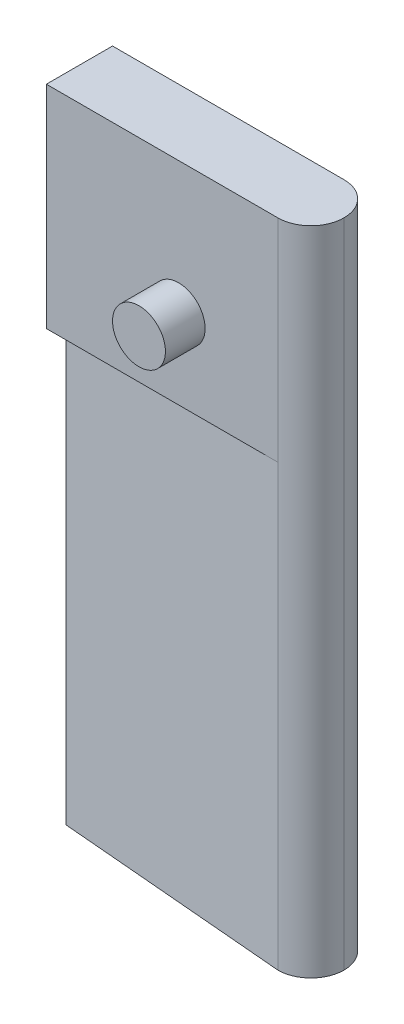
ISO-10303-21;
HEADER;
FILE_DESCRIPTION(('STEP AP214'),'2;1');
FILE_NAME('part.step','',(''),(''),'','','');
FILE_SCHEMA(('AUTOMOTIVE_DESIGN { 1 0 10303 214 1 1 1 1 }'));
ENDSEC;
DATA;
#1=APPLICATION_CONTEXT('core data for automotive mechanical design processes');
#2=APPLICATION_PROTOCOL_DEFINITION('international standard','automotive_design',2000,#1);
#3=PRODUCT_CONTEXT('',#1,'mechanical');
#4=PRODUCT('Part','Part','',(#3));
#5=PRODUCT_RELATED_PRODUCT_CATEGORY('part','',(#4));
#6=PRODUCT_DEFINITION_FORMATION('','',#4);
#7=PRODUCT_DEFINITION_CONTEXT('part definition',#1,'design');
#8=PRODUCT_DEFINITION('design','',#6,#7);
#9=PRODUCT_DEFINITION_SHAPE('','',#8);
#10=(LENGTH_UNIT() NAMED_UNIT(*) SI_UNIT(.MILLI.,.METRE.));
#11=(NAMED_UNIT(*) PLANE_ANGLE_UNIT() SI_UNIT($,.RADIAN.));
#12=(NAMED_UNIT(*) SI_UNIT($,.STERADIAN.) SOLID_ANGLE_UNIT());
#13=UNCERTAINTY_MEASURE_WITH_UNIT(LENGTH_MEASURE(1.E-05),#10,'distance_accuracy_value','');
#14=(GEOMETRIC_REPRESENTATION_CONTEXT(3) GLOBAL_UNCERTAINTY_ASSIGNED_CONTEXT((#13)) GLOBAL_UNIT_ASSIGNED_CONTEXT((#10,
#11,#12)) REPRESENTATION_CONTEXT('',''));
#15=CARTESIAN_POINT('',(0.,0.,0.));
#16=DIRECTION('',(0.,0.,1.));
#17=DIRECTION('',(1.,0.,0.));
#18=AXIS2_PLACEMENT_3D('',#15,#16,#17);
#19=CARTESIAN_POINT('',(-10.,0.,2.5));
#20=DIRECTION('',(0.,1.,0.));
#21=DIRECTION('',(-1.,0.,0.));
#22=AXIS2_PLACEMENT_3D('',#19,#20,#21);
#23=PLANE('',#22);
#24=DIRECTION('',(-0.996346649041751,0.,0.0854011413464362));
#25=VECTOR('',#24,1.);
#26=CARTESIAN_POINT('',(-0.158022690437602,0.,-1.84359805510534));
#27=LINE('',#26,#25);
#28=CARTESIAN_POINT('',(7.50000000000002,0.,-2.5));
#29=VERTEX_POINT('',#28);
#30=CARTESIAN_POINT('',(-9.99999999999998,0.,-0.999999999999992));
#31=VERTEX_POINT('',#30);
#32=EDGE_CURVE('E108',#29,#31,#27,.T.);
#33=ORIENTED_EDGE('',*,*,#32,.F.);
#34=CARTESIAN_POINT('',(7.5,0.,0.));
#35=DIRECTION('',(0.,1.,0.));
#36=DIRECTION('',(-1.,0.,0.));
#37=AXIS2_PLACEMENT_3D('',#34,#35,#36);
#38=CIRCLE('',#37,2.5);
#39=CARTESIAN_POINT('',(10.,0.,0.));
#40=VERTEX_POINT('',#39);
#41=EDGE_CURVE('E119',#29,#40,#38,.F.);
#42=ORIENTED_EDGE('',*,*,#41,.T.);
#43=CARTESIAN_POINT('',(7.5,0.,0.));
#44=DIRECTION('',(0.,1.,0.));
#45=DIRECTION('',(-1.,0.,0.));
#46=AXIS2_PLACEMENT_3D('',#43,#44,#45);
#47=CIRCLE('',#46,2.5);
#48=CARTESIAN_POINT('',(7.50000000000002,0.,2.5));
#49=VERTEX_POINT('',#48);
#50=EDGE_CURVE('E135',#40,#49,#47,.F.);
#51=ORIENTED_EDGE('',*,*,#50,.T.);
#52=DIRECTION('',(0.996346649041751,0.,0.0854011413464352));
#53=VECTOR('',#52,1.);
#54=CARTESIAN_POINT('',(-0.1580226904376,0.,1.84359805510535));
#55=LINE('',#54,#53);
#56=CARTESIAN_POINT('',(-9.99999999999998,0.,1.00000000000001));
#57=VERTEX_POINT('',#56);
#58=EDGE_CURVE('E143',#57,#49,#55,.T.);
#59=ORIENTED_EDGE('',*,*,#58,.F.);
#60=DIRECTION('',(0.,0.,-1.));
#61=VECTOR('',#60,1.);
#62=CARTESIAN_POINT('',(-10.,0.,2.5));
#63=LINE('',#62,#61);
#64=EDGE_CURVE('E121',#57,#31,#63,.T.);
#65=ORIENTED_EDGE('',*,*,#64,.T.);
#66=EDGE_LOOP('',(#33,#42,#51,#59,#65));
#67=FACE_BOUND('',#66,.T.);
#68=ADVANCED_FACE('F39',(#67),#23,.F.);
#69=CARTESIAN_POINT('',(0.,0.,2.5));
#70=DIRECTION('',(0.,0.,1.));
#71=DIRECTION('',(1.,0.,0.));
#72=AXIS2_PLACEMENT_3D('',#69,#70,#71);
#73=PLANE('',#72);
#74=CARTESIAN_POINT('',(0.,39.25,2.5));
#75=DIRECTION('',(0.,0.,1.));
#76=DIRECTION('',(1.,0.,0.));
#77=AXIS2_PLACEMENT_3D('',#74,#75,#76);
#78=CIRCLE('',#77,2.);
#79=CARTESIAN_POINT('',(2.,39.25,2.5));
#80=VERTEX_POINT('',#79);
#81=EDGE_CURVE('E153',#80,#80,#78,.F.);
#82=ORIENTED_EDGE('',*,*,#81,.T.);
#83=EDGE_LOOP('',(#82));
#84=FACE_BOUND('',#83,.T.);
#85=DIRECTION('',(0.,-1.,0.));
#86=VECTOR('',#85,1.);
#87=CARTESIAN_POINT('',(-10.,0.,2.5));
#88=LINE('',#87,#86);
#89=CARTESIAN_POINT('',(-9.99999999999998,49.25,2.5));
#90=VERTEX_POINT('',#89);
#91=CARTESIAN_POINT('',(-9.99999999999998,33.25,2.5));
#92=VERTEX_POINT('',#91);
#93=EDGE_CURVE('E159',#90,#92,#88,.T.);
#94=ORIENTED_EDGE('',*,*,#93,.T.);
#95=DIRECTION('',(1.,0.,0.));
#96=VECTOR('',#95,1.);
#97=CARTESIAN_POINT('',(0.,33.25,2.5));
#98=LINE('',#97,#96);
#99=CARTESIAN_POINT('',(7.50000000000001,33.25,2.5));
#100=VERTEX_POINT('',#99);
#101=EDGE_CURVE('E148',#92,#100,#98,.T.);
#102=ORIENTED_EDGE('',*,*,#101,.T.);
#103=DIRECTION('',(0.,1.,0.));
#104=VECTOR('',#103,1.);
#105=CARTESIAN_POINT('',(7.50000000000002,49.25,2.5));
#106=LINE('',#105,#104);
#107=CARTESIAN_POINT('',(7.50000000000002,49.25,2.5));
#108=VERTEX_POINT('',#107);
#109=EDGE_CURVE('E133',#100,#108,#106,.T.);
#110=ORIENTED_EDGE('',*,*,#109,.T.);
#111=DIRECTION('',(-1.,0.,0.));
#112=VECTOR('',#111,1.);
#113=CARTESIAN_POINT('',(-9.99999999999998,49.25,2.5));
#114=LINE('',#113,#112);
#115=EDGE_CURVE('E157',#108,#90,#114,.T.);
#116=ORIENTED_EDGE('',*,*,#115,.T.);
#117=EDGE_LOOP('',(#94,#102,#110,#116));
#118=FACE_BOUND('',#117,.T.);
#119=ADVANCED_FACE('F220',(#84,#118),#73,.T.);
#120=CARTESIAN_POINT('',(-9.99999999999998,49.25,2.5));
#121=DIRECTION('',(0.,-1.,0.));
#122=DIRECTION('',(0.,0.,-1.));
#123=AXIS2_PLACEMENT_3D('',#120,#121,#122);
#124=PLANE('',#123);
#125=CARTESIAN_POINT('',(7.50000000000002,49.25,0.));
#126=DIRECTION('',(0.,-1.,0.));
#127=DIRECTION('',(0.,0.,-1.));
#128=AXIS2_PLACEMENT_3D('',#125,#126,#127);
#129=CIRCLE('',#128,2.5);
#130=CARTESIAN_POINT('',(10.,49.25,0.));
#131=VERTEX_POINT('',#130);
#132=EDGE_CURVE('E169',#108,#131,#129,.F.);
#133=ORIENTED_EDGE('',*,*,#132,.T.);
#134=CARTESIAN_POINT('',(7.50000000000002,49.25,0.));
#135=DIRECTION('',(0.,-1.,0.));
#136=DIRECTION('',(0.,0.,-1.));
#137=AXIS2_PLACEMENT_3D('',#134,#135,#136);
#138=CIRCLE('',#137,2.5);
#139=CARTESIAN_POINT('',(7.50000000000002,49.25,-2.5));
#140=VERTEX_POINT('',#139);
#141=EDGE_CURVE('E171',#131,#140,#138,.F.);
#142=ORIENTED_EDGE('',*,*,#141,.T.);
#143=DIRECTION('',(-1.,0.,0.));
#144=VECTOR('',#143,1.);
#145=CARTESIAN_POINT('',(-9.99999999999998,49.25,-2.5));
#146=LINE('',#145,#144);
#147=CARTESIAN_POINT('',(-9.99999999999998,49.25,-2.5));
#148=VERTEX_POINT('',#147);
#149=EDGE_CURVE('E137',#140,#148,#146,.T.);
#150=ORIENTED_EDGE('',*,*,#149,.T.);
#151=DIRECTION('',(0.,0.,-1.));
#152=VECTOR('',#151,1.);
#153=CARTESIAN_POINT('',(-9.99999999999998,49.25,2.5));
#154=LINE('',#153,#152);
#155=EDGE_CURVE('E168',#90,#148,#154,.T.);
#156=ORIENTED_EDGE('',*,*,#155,.F.);
#157=ORIENTED_EDGE('',*,*,#115,.F.);
#158=EDGE_LOOP('',(#133,#142,#150,#156,#157));
#159=FACE_BOUND('',#158,.T.);
#160=ADVANCED_FACE('F178',(#159),#124,.F.);
#161=CARTESIAN_POINT('',(-10.,0.,2.5));
#162=DIRECTION('',(1.,0.,0.));
#163=DIRECTION('',(0.,1.,0.));
#164=AXIS2_PLACEMENT_3D('',#161,#162,#163);
#165=PLANE('',#164);
#166=DIRECTION('',(0.,-1.,0.));
#167=VECTOR('',#166,1.);
#168=CARTESIAN_POINT('',(-10.,0.,-2.5));
#169=LINE('',#168,#167);
#170=CARTESIAN_POINT('',(-9.99999999999999,33.25,-2.5));
#171=VERTEX_POINT('',#170);
#172=EDGE_CURVE('E138',#148,#171,#169,.T.);
#173=ORIENTED_EDGE('',*,*,#172,.T.);
#174=DIRECTION('',(0.,0.,1.));
#175=VECTOR('',#174,1.);
#176=CARTESIAN_POINT('',(-9.99999999999998,33.25,0.));
#177=LINE('',#176,#175);
#178=CARTESIAN_POINT('',(-9.99999999999998,33.25,-0.999999999999992));
#179=VERTEX_POINT('',#178);
#180=EDGE_CURVE('E53',#171,#179,#177,.T.);
#181=ORIENTED_EDGE('',*,*,#180,.T.);
#182=DIRECTION('',(0.,1.,0.));
#183=VECTOR('',#182,1.);
#184=CARTESIAN_POINT('',(-9.99999999999998,0.,-0.999999999999992));
#185=LINE('',#184,#183);
#186=EDGE_CURVE('E114',#31,#179,#185,.T.);
#187=ORIENTED_EDGE('',*,*,#186,.F.);
#188=ORIENTED_EDGE('',*,*,#64,.F.);
#189=DIRECTION('',(0.,1.,0.));
#190=VECTOR('',#189,1.);
#191=CARTESIAN_POINT('',(-9.99999999999998,0.,1.00000000000001));
#192=LINE('',#191,#190);
#193=CARTESIAN_POINT('',(-9.99999999999998,33.25,1.00000000000001));
#194=VERTEX_POINT('',#193);
#195=EDGE_CURVE('E150',#57,#194,#192,.T.);
#196=ORIENTED_EDGE('',*,*,#195,.T.);
#197=DIRECTION('',(0.,0.,1.));
#198=VECTOR('',#197,1.);
#199=CARTESIAN_POINT('',(-9.99999999999998,33.25,0.));
#200=LINE('',#199,#198);
#201=EDGE_CURVE('E146',#194,#92,#200,.T.);
#202=ORIENTED_EDGE('',*,*,#201,.T.);
#203=ORIENTED_EDGE('',*,*,#93,.F.);
#204=ORIENTED_EDGE('',*,*,#155,.T.);
#205=EDGE_LOOP('',(#173,#181,#187,#188,#196,#202,#203,#204));
#206=FACE_BOUND('',#205,.T.);
#207=ADVANCED_FACE('F190',(#206),#165,.F.);
#208=CARTESIAN_POINT('',(0.,0.,-2.5));
#209=DIRECTION('',(0.,0.,1.));
#210=DIRECTION('',(1.,0.,0.));
#211=AXIS2_PLACEMENT_3D('',#208,#209,#210);
#212=PLANE('',#211);
#213=CARTESIAN_POINT('',(0.,39.25,-2.5));
#214=DIRECTION('',(0.,0.,1.));
#215=DIRECTION('',(1.,0.,0.));
#216=AXIS2_PLACEMENT_3D('',#213,#214,#215);
#217=CIRCLE('',#216,2.);
#218=CARTESIAN_POINT('',(2.,39.25,-2.5));
#219=VERTEX_POINT('',#218);
#220=EDGE_CURVE('E11',#219,#219,#217,.F.);
#221=ORIENTED_EDGE('',*,*,#220,.F.);
#222=EDGE_LOOP('',(#221));
#223=FACE_BOUND('',#222,.T.);
#224=DIRECTION('',(0.,1.,0.));
#225=VECTOR('',#224,1.);
#226=CARTESIAN_POINT('',(7.5,0.,-2.5));
#227=LINE('',#226,#225);
#228=CARTESIAN_POINT('',(7.50000000000002,33.25,-2.5));
#229=VERTEX_POINT('',#228);
#230=EDGE_CURVE('E132',#140,#229,#227,.F.);
#231=ORIENTED_EDGE('',*,*,#230,.T.);
#232=DIRECTION('',(-1.,0.,0.));
#233=VECTOR('',#232,1.);
#234=CARTESIAN_POINT('',(0.,33.25,-2.5));
#235=LINE('',#234,#233);
#236=EDGE_CURVE('E176',#229,#171,#235,.T.);
#237=ORIENTED_EDGE('',*,*,#236,.T.);
#238=ORIENTED_EDGE('',*,*,#172,.F.);
#239=ORIENTED_EDGE('',*,*,#149,.F.);
#240=EDGE_LOOP('',(#231,#237,#238,#239));
#241=FACE_BOUND('',#240,.T.);
#242=ADVANCED_FACE('F172',(#223,#241),#212,.F.);
#243=CARTESIAN_POINT('',(7.5,0.,0.));
#244=DIRECTION('',(0.,-1.,0.));
#245=DIRECTION('',(1.,0.,0.));
#246=AXIS2_PLACEMENT_3D('',#243,#244,#245);
#247=CYLINDRICAL_SURFACE('',#246,2.5);
#248=EDGE_CURVE('E50',#49,#100,#106,.T.);
#249=ORIENTED_EDGE('',*,*,#248,.F.);
#250=ORIENTED_EDGE('',*,*,#50,.F.);
#251=DIRECTION('',(0.,1.,0.));
#252=VECTOR('',#251,1.);
#253=CARTESIAN_POINT('',(10.,0.,0.));
#254=LINE('',#253,#252);
#255=EDGE_CURVE('E126',#131,#40,#254,.F.);
#256=ORIENTED_EDGE('',*,*,#255,.F.);
#257=ORIENTED_EDGE('',*,*,#132,.F.);
#258=ORIENTED_EDGE('',*,*,#109,.F.);
#259=EDGE_LOOP('',(#249,#250,#256,#257,#258));
#260=FACE_BOUND('',#259,.T.);
#261=ADVANCED_FACE('F41',(#260),#247,.T.);
#262=CARTESIAN_POINT('',(7.5,0.,0.));
#263=DIRECTION('',(0.,1.,0.));
#264=DIRECTION('',(-1.,0.,0.));
#265=AXIS2_PLACEMENT_3D('',#262,#263,#264);
#266=CYLINDRICAL_SURFACE('',#265,2.5);
#267=ORIENTED_EDGE('',*,*,#41,.F.);
#268=DIRECTION('',(0.,1.,0.));
#269=VECTOR('',#268,1.);
#270=CARTESIAN_POINT('',(7.50000000000002,0.,-2.5));
#271=LINE('',#270,#269);
#272=EDGE_CURVE('E102',#29,#229,#271,.T.);
#273=ORIENTED_EDGE('',*,*,#272,.T.);
#274=ORIENTED_EDGE('',*,*,#230,.F.);
#275=ORIENTED_EDGE('',*,*,#141,.F.);
#276=ORIENTED_EDGE('',*,*,#255,.T.);
#277=EDGE_LOOP('',(#267,#273,#274,#275,#276));
#278=FACE_BOUND('',#277,.T.);
#279=ADVANCED_FACE('F130',(#278),#266,.T.);
#280=CARTESIAN_POINT('',(-0.158022690437602,0.,-1.84359805510534));
#281=DIRECTION('',(-0.0854011413464362,0.,-0.996346649041751));
#282=DIRECTION('',(-0.996346649041751,0.,0.0854011413464362));
#283=AXIS2_PLACEMENT_3D('',#280,#281,#282);
#284=PLANE('',#283);
#285=DIRECTION('',(-0.996346649041751,0.,0.0854011413464362));
#286=VECTOR('',#285,1.);
#287=CARTESIAN_POINT('',(-0.158022690437602,33.25,-1.84359805510534));
#288=LINE('',#287,#286);
#289=EDGE_CURVE('E109',#229,#179,#288,.T.);
#290=ORIENTED_EDGE('',*,*,#289,.F.);
#291=ORIENTED_EDGE('',*,*,#272,.F.);
#292=ORIENTED_EDGE('',*,*,#32,.T.);
#293=ORIENTED_EDGE('',*,*,#186,.T.);
#294=EDGE_LOOP('',(#290,#291,#292,#293));
#295=FACE_BOUND('',#294,.T.);
#296=ADVANCED_FACE('F110',(#295),#284,.T.);
#297=CARTESIAN_POINT('',(0.,33.25,0.));
#298=DIRECTION('',(0.,1.,0.));
#299=DIRECTION('',(0.,0.,1.));
#300=AXIS2_PLACEMENT_3D('',#297,#298,#299);
#301=PLANE('',#300);
#302=ORIENTED_EDGE('',*,*,#289,.T.);
#303=ORIENTED_EDGE('',*,*,#180,.F.);
#304=ORIENTED_EDGE('',*,*,#236,.F.);
#305=EDGE_LOOP('',(#302,#303,#304));
#306=FACE_BOUND('',#305,.T.);
#307=ADVANCED_FACE('F231',(#306),#301,.F.);
#308=CARTESIAN_POINT('',(-0.1580226904376,0.,1.84359805510535));
#309=DIRECTION('',(-0.0854011413464352,0.,0.996346649041751));
#310=DIRECTION('',(0.996346649041751,0.,0.0854011413464352));
#311=AXIS2_PLACEMENT_3D('',#308,#309,#310);
#312=PLANE('',#311);
#313=DIRECTION('',(0.996346649041751,0.,0.0854011413464352));
#314=VECTOR('',#313,1.);
#315=CARTESIAN_POINT('',(-0.1580226904376,33.25,1.84359805510535));
#316=LINE('',#315,#314);
#317=EDGE_CURVE('E65',#194,#100,#316,.T.);
#318=ORIENTED_EDGE('',*,*,#317,.F.);
#319=ORIENTED_EDGE('',*,*,#195,.F.);
#320=ORIENTED_EDGE('',*,*,#58,.T.);
#321=ORIENTED_EDGE('',*,*,#248,.T.);
#322=EDGE_LOOP('',(#318,#319,#320,#321));
#323=FACE_BOUND('',#322,.T.);
#324=ADVANCED_FACE('F244',(#323),#312,.T.);
#325=CARTESIAN_POINT('',(0.,33.25,0.));
#326=DIRECTION('',(0.,1.,0.));
#327=DIRECTION('',(0.,0.,1.));
#328=AXIS2_PLACEMENT_3D('',#325,#326,#327);
#329=PLANE('',#328);
#330=ORIENTED_EDGE('',*,*,#317,.T.);
#331=ORIENTED_EDGE('',*,*,#101,.F.);
#332=ORIENTED_EDGE('',*,*,#201,.F.);
#333=EDGE_LOOP('',(#330,#331,#332));
#334=FACE_BOUND('',#333,.T.);
#335=ADVANCED_FACE('F247',(#334),#329,.F.);
#336=CARTESIAN_POINT('',(0.,39.25,-5.5));
#337=DIRECTION('',(0.,0.,1.));
#338=DIRECTION('',(1.,0.,0.));
#339=AXIS2_PLACEMENT_3D('',#336,#337,#338);
#340=PLANE('',#339);
#341=CARTESIAN_POINT('',(0.,39.25,-5.5));
#342=DIRECTION('',(0.,0.,1.));
#343=DIRECTION('',(1.,0.,0.));
#344=AXIS2_PLACEMENT_3D('',#341,#342,#343);
#345=CIRCLE('',#344,2.);
#346=CARTESIAN_POINT('',(2.,39.25,-5.5));
#347=VERTEX_POINT('',#346);
#348=EDGE_CURVE('E193',#347,#347,#345,.T.);
#349=ORIENTED_EDGE('',*,*,#348,.F.);
#350=EDGE_LOOP('',(#349));
#351=FACE_BOUND('',#350,.T.);
#352=ADVANCED_FACE('F212',(#351),#340,.F.);
#353=CARTESIAN_POINT('',(0.,39.25,5.5));
#354=DIRECTION('',(0.,0.,-1.));
#355=DIRECTION('',(-1.,0.,0.));
#356=AXIS2_PLACEMENT_3D('',#353,#354,#355);
#357=CYLINDRICAL_SURFACE('',#356,2.);
#358=ORIENTED_EDGE('',*,*,#348,.T.);
#359=EDGE_LOOP('',(#358));
#360=FACE_BOUND('',#359,.T.);
#361=ORIENTED_EDGE('',*,*,#220,.T.);
#362=EDGE_LOOP('',(#361));
#363=FACE_BOUND('',#362,.T.);
#364=ADVANCED_FACE('F202',(#360,#363),#357,.T.);
#365=ORIENTED_EDGE('',*,*,#81,.F.);
#366=EDGE_LOOP('',(#365));
#367=FACE_BOUND('',#366,.T.);
#368=CARTESIAN_POINT('',(0.,39.25,5.5));
#369=DIRECTION('',(0.,0.,1.));
#370=DIRECTION('',(1.,0.,0.));
#371=AXIS2_PLACEMENT_3D('',#368,#369,#370);
#372=CIRCLE('',#371,2.);
#373=CARTESIAN_POINT('',(2.,39.25,5.5));
#374=VERTEX_POINT('',#373);
#375=EDGE_CURVE('E195',#374,#374,#372,.T.);
#376=ORIENTED_EDGE('',*,*,#375,.F.);
#377=EDGE_LOOP('',(#376));
#378=FACE_BOUND('',#377,.T.);
#379=ADVANCED_FACE('F201',(#367,#378),#357,.T.);
#380=CARTESIAN_POINT('',(0.,39.25,5.5));
#381=DIRECTION('',(0.,0.,1.));
#382=DIRECTION('',(1.,0.,0.));
#383=AXIS2_PLACEMENT_3D('',#380,#381,#382);
#384=PLANE('',#383);
#385=ORIENTED_EDGE('',*,*,#375,.T.);
#386=EDGE_LOOP('',(#385));
#387=FACE_BOUND('',#386,.T.);
#388=ADVANCED_FACE('F199',(#387),#384,.T.);
#389=CLOSED_SHELL('',(#68,#119,#160,#207,#242,#261,#279,#296,#307,#324,#335,#352,#364,#379,#388));
#390=MANIFOLD_SOLID_BREP('B2',#389);
#391=ADVANCED_BREP_SHAPE_REPRESENTATION('',(#18,#390),#14);
#392=SHAPE_DEFINITION_REPRESENTATION(#9,#391);
ENDSEC;
END-ISO-10303-21;
